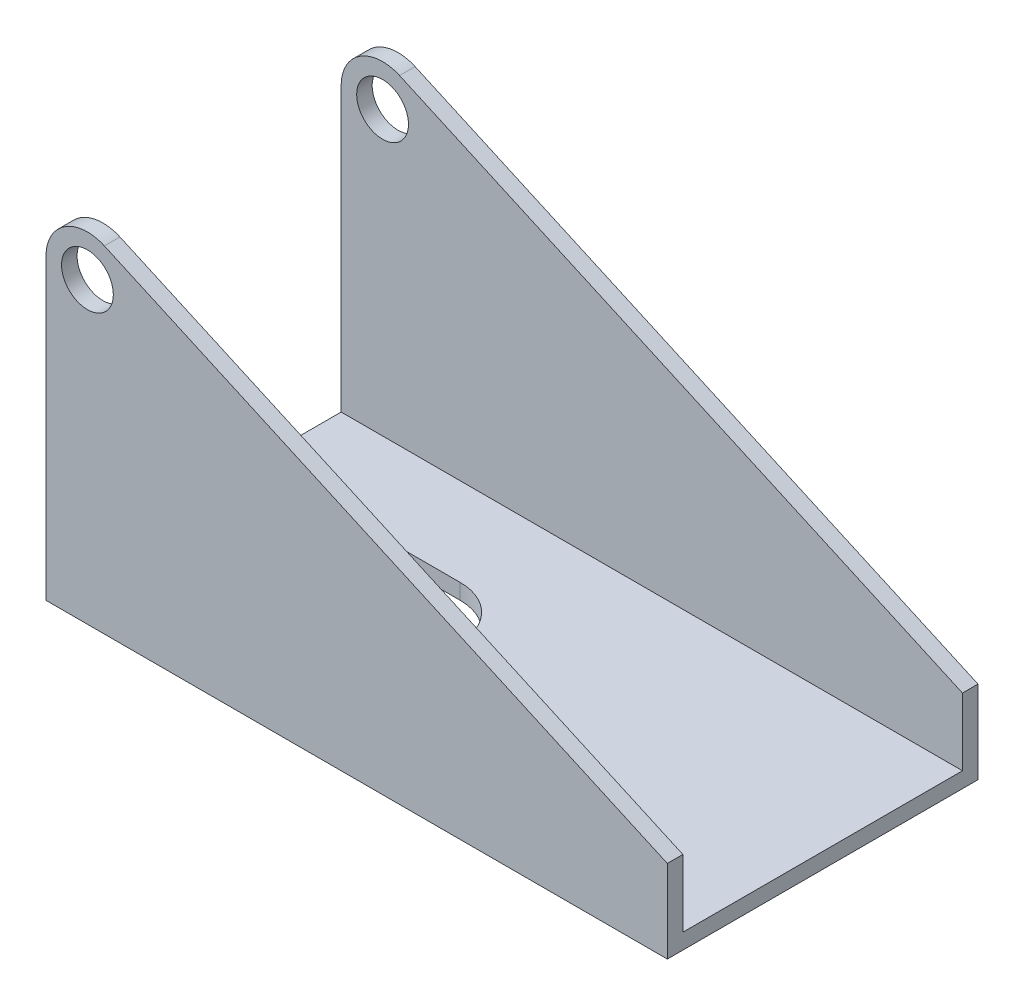
ISO-10303-21;
HEADER;
FILE_DESCRIPTION(('STEP AP214'),'2;1');
FILE_NAME('part.step','',(''),(''),'','','');
FILE_SCHEMA(('AUTOMOTIVE_DESIGN { 1 0 10303 214 1 1 1 1 }'));
ENDSEC;
DATA;
#1=APPLICATION_CONTEXT('core data for automotive mechanical design processes');
#2=APPLICATION_PROTOCOL_DEFINITION('international standard','automotive_design',2000,#1);
#3=PRODUCT_CONTEXT('',#1,'mechanical');
#4=PRODUCT('Part','Part','',(#3));
#5=PRODUCT_RELATED_PRODUCT_CATEGORY('part','',(#4));
#6=PRODUCT_DEFINITION_FORMATION('','',#4);
#7=PRODUCT_DEFINITION_CONTEXT('part definition',#1,'design');
#8=PRODUCT_DEFINITION('design','',#6,#7);
#9=PRODUCT_DEFINITION_SHAPE('','',#8);
#10=(LENGTH_UNIT() NAMED_UNIT(*) SI_UNIT(.MILLI.,.METRE.));
#11=(NAMED_UNIT(*) PLANE_ANGLE_UNIT() SI_UNIT($,.RADIAN.));
#12=(NAMED_UNIT(*) SI_UNIT($,.STERADIAN.) SOLID_ANGLE_UNIT());
#13=UNCERTAINTY_MEASURE_WITH_UNIT(LENGTH_MEASURE(1.E-05),#10,'distance_accuracy_value','');
#14=(GEOMETRIC_REPRESENTATION_CONTEXT(3) GLOBAL_UNCERTAINTY_ASSIGNED_CONTEXT((#13)) GLOBAL_UNIT_ASSIGNED_CONTEXT((#10,
#11,#12)) REPRESENTATION_CONTEXT('',''));
#15=CARTESIAN_POINT('',(0.,0.,0.));
#16=DIRECTION('',(0.,0.,1.));
#17=DIRECTION('',(1.,0.,0.));
#18=AXIS2_PLACEMENT_3D('',#15,#16,#17);
#19=CARTESIAN_POINT('',(-13.9101951841175,10.6588235294118,30.));
#20=DIRECTION('',(1.,0.,0.));
#21=DIRECTION('',(0.,0.,-1.));
#22=AXIS2_PLACEMENT_3D('',#19,#20,#21);
#23=PLANE('',#22);
#24=DIRECTION('',(0.,0.,1.));
#25=VECTOR('',#24,1.);
#26=CARTESIAN_POINT('',(-13.9101951841175,12.1588235294118,1.5));
#27=LINE('',#26,#25);
#28=CARTESIAN_POINT('',(-13.9101951841175,12.1588235294118,20.));
#29=VERTEX_POINT('',#28);
#30=CARTESIAN_POINT('',(-13.9101951841175,12.1588235294118,28.5));
#31=VERTEX_POINT('',#30);
#32=EDGE_CURVE('E170',#29,#31,#27,.T.);
#33=ORIENTED_EDGE('',*,*,#32,.F.);
#34=DIRECTION('',(0.,-1.,0.));
#35=VECTOR('',#34,1.);
#36=CARTESIAN_POINT('',(-13.9101951841175,10.6588235294118,20.));
#37=LINE('',#36,#35);
#38=CARTESIAN_POINT('',(-13.9101951841175,10.6588235294118,20.));
#39=VERTEX_POINT('',#38);
#40=EDGE_CURVE('E162',#29,#39,#37,.T.);
#41=ORIENTED_EDGE('',*,*,#40,.T.);
#42=DIRECTION('',(0.,0.,-1.));
#43=VECTOR('',#42,1.);
#44=CARTESIAN_POINT('',(-13.9101951841175,10.6588235294118,30.));
#45=LINE('',#44,#43);
#46=CARTESIAN_POINT('',(-13.9101951841175,10.6588235294118,30.));
#47=VERTEX_POINT('',#46);
#48=EDGE_CURVE('E239',#47,#39,#45,.T.);
#49=ORIENTED_EDGE('',*,*,#48,.F.);
#50=DIRECTION('',(0.,-1.,0.));
#51=VECTOR('',#50,1.);
#52=CARTESIAN_POINT('',(-13.9101951841175,10.6588235294118,30.));
#53=LINE('',#52,#51);
#54=CARTESIAN_POINT('',(-13.9101951841175,39.4724810895195,30.));
#55=VERTEX_POINT('',#54);
#56=EDGE_CURVE('E206',#55,#47,#53,.T.);
#57=ORIENTED_EDGE('',*,*,#56,.F.);
#58=DIRECTION('',(0.,0.,-1.));
#59=VECTOR('',#58,1.);
#60=CARTESIAN_POINT('',(-13.9101951841175,39.4724810895195,30.));
#61=LINE('',#60,#59);
#62=CARTESIAN_POINT('',(-13.9101951841175,39.4724810895195,28.5));
#63=VERTEX_POINT('',#62);
#64=EDGE_CURVE('E242',#55,#63,#61,.T.);
#65=ORIENTED_EDGE('',*,*,#64,.T.);
#66=DIRECTION('',(0.,1.,0.));
#67=VECTOR('',#66,1.);
#68=CARTESIAN_POINT('',(-13.9101951841175,74.7861386496272,28.5));
#69=LINE('',#68,#67);
#70=EDGE_CURVE('E165',#31,#63,#69,.T.);
#71=ORIENTED_EDGE('',*,*,#70,.F.);
#72=EDGE_LOOP('',(#33,#41,#49,#57,#65,#71));
#73=FACE_BOUND('',#72,.T.);
#74=ADVANCED_FACE('F32',(#73),#23,.F.);
#75=CARTESIAN_POINT('',(-9.91019518411749,39.4724810895195,30.));
#76=DIRECTION('',(0.,0.,-1.));
#77=DIRECTION('',(-1.,0.,0.));
#78=AXIS2_PLACEMENT_3D('',#75,#76,#77);
#79=CYLINDRICAL_SURFACE('',#78,4.);
#80=DIRECTION('',(0.,0.,-1.));
#81=VECTOR('',#80,1.);
#82=CARTESIAN_POINT('',(-8.2687364748023,43.1201671102199,30.));
#83=LINE('',#82,#81);
#84=CARTESIAN_POINT('',(-8.2687364748023,43.1201671102199,30.));
#85=VERTEX_POINT('',#84);
#86=CARTESIAN_POINT('',(-8.2687364748023,43.1201671102199,28.5));
#87=VERTEX_POINT('',#86);
#88=EDGE_CURVE('E228',#85,#87,#83,.T.);
#89=ORIENTED_EDGE('',*,*,#88,.T.);
#90=CARTESIAN_POINT('',(-9.91019518411749,39.4724810895195,28.5));
#91=DIRECTION('',(0.,0.,1.));
#92=DIRECTION('',(0.,-1.,0.));
#93=AXIS2_PLACEMENT_3D('',#90,#91,#92);
#94=CIRCLE('',#93,4.);
#95=EDGE_CURVE('E193',#87,#63,#94,.T.);
#96=ORIENTED_EDGE('',*,*,#95,.T.);
#97=ORIENTED_EDGE('',*,*,#64,.F.);
#98=CARTESIAN_POINT('',(-9.91019518411749,39.4724810895195,30.));
#99=DIRECTION('',(0.,0.,1.));
#100=DIRECTION('',(-1.,0.,0.));
#101=AXIS2_PLACEMENT_3D('',#98,#99,#100);
#102=CIRCLE('',#101,4.);
#103=EDGE_CURVE('E203',#85,#55,#102,.T.);
#104=ORIENTED_EDGE('',*,*,#103,.F.);
#105=EDGE_LOOP('',(#89,#96,#97,#104));
#106=FACE_BOUND('',#105,.T.);
#107=ADVANCED_FACE('F271',(#106),#79,.T.);
#108=CARTESIAN_POINT('',(-8.2687364748023,43.1201671102199,30.));
#109=DIRECTION('',(-0.410364677328798,-0.911921505175107,0.));
#110=DIRECTION('',(0.911921505175107,-0.410364677328798,0.));
#111=AXIS2_PLACEMENT_3D('',#108,#109,#110);
#112=PLANE('',#111);
#113=DIRECTION('',(0.,0.,-1.));
#114=VECTOR('',#113,1.);
#115=CARTESIAN_POINT('',(46.0898048158825,18.6588235294118,30.));
#116=LINE('',#115,#114);
#117=CARTESIAN_POINT('',(46.0898048158825,18.6588235294118,30.));
#118=VERTEX_POINT('',#117);
#119=CARTESIAN_POINT('',(46.0898048158825,18.6588235294118,28.5));
#120=VERTEX_POINT('',#119);
#121=EDGE_CURVE('E232',#118,#120,#116,.T.);
#122=ORIENTED_EDGE('',*,*,#121,.T.);
#123=DIRECTION('',(-0.911921505175107,0.410364677328798,0.));
#124=VECTOR('',#123,1.);
#125=CARTESIAN_POINT('',(-8.2687364748023,43.1201671102199,28.5));
#126=LINE('',#125,#124);
#127=EDGE_CURVE('E187',#120,#87,#126,.T.);
#128=ORIENTED_EDGE('',*,*,#127,.T.);
#129=ORIENTED_EDGE('',*,*,#88,.F.);
#130=DIRECTION('',(-0.911921505175106,0.410364677328798,0.));
#131=VECTOR('',#130,1.);
#132=CARTESIAN_POINT('',(-8.2687364748023,43.1201671102199,30.));
#133=LINE('',#132,#131);
#134=EDGE_CURVE('E213',#118,#85,#133,.T.);
#135=ORIENTED_EDGE('',*,*,#134,.F.);
#136=EDGE_LOOP('',(#122,#128,#129,#135));
#137=FACE_BOUND('',#136,.T.);
#138=ADVANCED_FACE('F276',(#137),#112,.F.);
#139=CARTESIAN_POINT('',(-9.91019518411749,39.4724810895195,0.));
#140=DIRECTION('',(0.,0.,1.));
#141=DIRECTION('',(1.,0.,0.));
#142=AXIS2_PLACEMENT_3D('',#139,#140,#141);
#143=CYLINDRICAL_SURFACE('',#142,2.5);
#144=CARTESIAN_POINT('',(-9.91019518411749,39.4724810895195,28.5));
#145=DIRECTION('',(0.,0.,1.));
#146=DIRECTION('',(0.,-1.,0.));
#147=AXIS2_PLACEMENT_3D('',#144,#145,#146);
#148=CIRCLE('',#147,2.5);
#149=CARTESIAN_POINT('',(-9.91019518411749,36.9724810895195,28.5));
#150=VERTEX_POINT('',#149);
#151=EDGE_CURVE('E186',#150,#150,#148,.F.);
#152=ORIENTED_EDGE('',*,*,#151,.T.);
#153=EDGE_LOOP('',(#152));
#154=FACE_BOUND('',#153,.T.);
#155=CARTESIAN_POINT('',(-9.91019518411749,39.4724810895195,30.));
#156=DIRECTION('',(0.,0.,1.));
#157=DIRECTION('',(1.,0.,0.));
#158=AXIS2_PLACEMENT_3D('',#155,#156,#157);
#159=CIRCLE('',#158,2.5);
#160=CARTESIAN_POINT('',(-7.41019518411749,39.4724810895195,30.));
#161=VERTEX_POINT('',#160);
#162=EDGE_CURVE('E196',#161,#161,#159,.T.);
#163=ORIENTED_EDGE('',*,*,#162,.T.);
#164=EDGE_LOOP('',(#163));
#165=FACE_BOUND('',#164,.T.);
#166=ADVANCED_FACE('F294',(#154,#165),#143,.F.);
#167=CARTESIAN_POINT('',(-13.9101951841175,39.4724810895195,1.5));
#168=VERTEX_POINT('',#167);
#169=CARTESIAN_POINT('',(-13.9101951841175,39.4724810895195,0.));
#170=VERTEX_POINT('',#169);
#171=EDGE_CURVE('E241',#168,#170,#61,.T.);
#172=ORIENTED_EDGE('',*,*,#171,.F.);
#173=CARTESIAN_POINT('',(-9.91019518411749,39.4724810895195,1.5));
#174=DIRECTION('',(0.,0.,-1.));
#175=DIRECTION('',(-1.,0.,0.));
#176=AXIS2_PLACEMENT_3D('',#173,#174,#175);
#177=CIRCLE('',#176,4.);
#178=CARTESIAN_POINT('',(-8.2687364748023,43.1201671102199,1.5));
#179=VERTEX_POINT('',#178);
#180=EDGE_CURVE('E183',#168,#179,#177,.T.);
#181=ORIENTED_EDGE('',*,*,#180,.T.);
#182=CARTESIAN_POINT('',(-8.2687364748023,43.1201671102199,0.));
#183=VERTEX_POINT('',#182);
#184=EDGE_CURVE('E215',#179,#183,#83,.T.);
#185=ORIENTED_EDGE('',*,*,#184,.T.);
#186=CARTESIAN_POINT('',(-9.91019518411749,39.4724810895195,0.));
#187=DIRECTION('',(0.,0.,1.));
#188=DIRECTION('',(-1.,0.,0.));
#189=AXIS2_PLACEMENT_3D('',#186,#187,#188);
#190=CIRCLE('',#189,4.);
#191=EDGE_CURVE('E200',#183,#170,#190,.T.);
#192=ORIENTED_EDGE('',*,*,#191,.T.);
#193=EDGE_LOOP('',(#172,#181,#185,#192));
#194=FACE_BOUND('',#193,.T.);
#195=ADVANCED_FACE('F34',(#194),#79,.T.);
#196=CARTESIAN_POINT('',(-13.9101951841175,10.6588235294118,10.));
#197=VERTEX_POINT('',#196);
#198=CARTESIAN_POINT('',(-13.9101951841175,10.6588235294118,0.));
#199=VERTEX_POINT('',#198);
#200=EDGE_CURVE('E238',#197,#199,#45,.T.);
#201=ORIENTED_EDGE('',*,*,#200,.F.);
#202=DIRECTION('',(0.,1.,0.));
#203=VECTOR('',#202,1.);
#204=CARTESIAN_POINT('',(-13.9101951841175,10.6588235294118,10.));
#205=LINE('',#204,#203);
#206=CARTESIAN_POINT('',(-13.9101951841175,12.1588235294118,10.));
#207=VERTEX_POINT('',#206);
#208=EDGE_CURVE('E148',#197,#207,#205,.T.);
#209=ORIENTED_EDGE('',*,*,#208,.T.);
#210=CARTESIAN_POINT('',(-13.9101951841175,12.1588235294118,1.5));
#211=VERTEX_POINT('',#210);
#212=EDGE_CURVE('E171',#211,#207,#27,.T.);
#213=ORIENTED_EDGE('',*,*,#212,.F.);
#214=DIRECTION('',(0.,-1.,0.));
#215=VECTOR('',#214,1.);
#216=CARTESIAN_POINT('',(-13.9101951841175,74.7861386496272,1.5));
#217=LINE('',#216,#215);
#218=EDGE_CURVE('E167',#168,#211,#217,.T.);
#219=ORIENTED_EDGE('',*,*,#218,.F.);
#220=ORIENTED_EDGE('',*,*,#171,.T.);
#221=DIRECTION('',(0.,-1.,0.));
#222=VECTOR('',#221,1.);
#223=CARTESIAN_POINT('',(-13.9101951841175,10.6588235294118,0.));
#224=LINE('',#223,#222);
#225=EDGE_CURVE('E218',#170,#199,#224,.T.);
#226=ORIENTED_EDGE('',*,*,#225,.T.);
#227=EDGE_LOOP('',(#201,#209,#213,#219,#220,#226));
#228=FACE_BOUND('',#227,.T.);
#229=ADVANCED_FACE('F261',(#228),#23,.F.);
#230=CARTESIAN_POINT('',(46.0898048158825,10.6588235294118,30.));
#231=DIRECTION('',(0.,1.,0.));
#232=DIRECTION('',(-1.,0.,0.));
#233=AXIS2_PLACEMENT_3D('',#230,#231,#232);
#234=PLANE('',#233);
#235=ORIENTED_EDGE('',*,*,#48,.T.);
#236=DIRECTION('',(1.,0.,0.));
#237=VECTOR('',#236,1.);
#238=CARTESIAN_POINT('',(-33.9101951841175,10.6588235294118,20.));
#239=LINE('',#238,#237);
#240=CARTESIAN_POINT('',(6.0898048158825,10.6588235294118,20.));
#241=VERTEX_POINT('',#240);
#242=EDGE_CURVE('E142',#39,#241,#239,.T.);
#243=ORIENTED_EDGE('',*,*,#242,.T.);
#244=CARTESIAN_POINT('',(6.0898048158825,10.6588235294118,15.));
#245=DIRECTION('',(0.,1.,0.));
#246=DIRECTION('',(0.,0.,1.));
#247=AXIS2_PLACEMENT_3D('',#244,#245,#246);
#248=CIRCLE('',#247,5.);
#249=CARTESIAN_POINT('',(6.0898048158825,10.6588235294118,10.));
#250=VERTEX_POINT('',#249);
#251=EDGE_CURVE('E137',#241,#250,#248,.T.);
#252=ORIENTED_EDGE('',*,*,#251,.T.);
#253=DIRECTION('',(-1.,0.,0.));
#254=VECTOR('',#253,1.);
#255=CARTESIAN_POINT('',(-33.9101951841175,10.6588235294118,10.));
#256=LINE('',#255,#254);
#257=EDGE_CURVE('E145',#250,#197,#256,.T.);
#258=ORIENTED_EDGE('',*,*,#257,.T.);
#259=ORIENTED_EDGE('',*,*,#200,.T.);
#260=DIRECTION('',(1.,0.,0.));
#261=VECTOR('',#260,1.);
#262=CARTESIAN_POINT('',(46.0898048158825,10.6588235294118,0.));
#263=LINE('',#262,#261);
#264=CARTESIAN_POINT('',(46.0898048158825,10.6588235294118,0.));
#265=VERTEX_POINT('',#264);
#266=EDGE_CURVE('E221',#199,#265,#263,.T.);
#267=ORIENTED_EDGE('',*,*,#266,.T.);
#268=DIRECTION('',(0.,0.,-1.));
#269=VECTOR('',#268,1.);
#270=CARTESIAN_POINT('',(46.0898048158825,10.6588235294118,30.));
#271=LINE('',#270,#269);
#272=CARTESIAN_POINT('',(46.0898048158825,10.6588235294118,30.));
#273=VERTEX_POINT('',#272);
#274=EDGE_CURVE('E235',#273,#265,#271,.T.);
#275=ORIENTED_EDGE('',*,*,#274,.F.);
#276=DIRECTION('',(1.,0.,0.));
#277=VECTOR('',#276,1.);
#278=CARTESIAN_POINT('',(46.0898048158825,10.6588235294118,30.));
#279=LINE('',#278,#277);
#280=EDGE_CURVE('E209',#47,#273,#279,.T.);
#281=ORIENTED_EDGE('',*,*,#280,.F.);
#282=EDGE_LOOP('',(#235,#243,#252,#258,#259,#267,#275,#281));
#283=FACE_BOUND('',#282,.T.);
#284=ADVANCED_FACE('F153',(#283),#234,.F.);
#285=CARTESIAN_POINT('',(46.0898048158825,18.6588235294118,30.));
#286=DIRECTION('',(-1.,0.,0.));
#287=DIRECTION('',(0.,0.,1.));
#288=AXIS2_PLACEMENT_3D('',#285,#286,#287);
#289=PLANE('',#288);
#290=DIRECTION('',(0.,0.,1.));
#291=VECTOR('',#290,1.);
#292=CARTESIAN_POINT('',(46.0898048158825,12.1588235294118,30.));
#293=LINE('',#292,#291);
#294=CARTESIAN_POINT('',(46.0898048158825,12.1588235294118,1.5));
#295=VERTEX_POINT('',#294);
#296=CARTESIAN_POINT('',(46.0898048158825,12.1588235294118,28.5));
#297=VERTEX_POINT('',#296);
#298=EDGE_CURVE('E40',#295,#297,#293,.T.);
#299=ORIENTED_EDGE('',*,*,#298,.T.);
#300=DIRECTION('',(0.,1.,0.));
#301=VECTOR('',#300,1.);
#302=CARTESIAN_POINT('',(46.0898048158825,18.6588235294118,28.5));
#303=LINE('',#302,#301);
#304=EDGE_CURVE('E190',#297,#120,#303,.T.);
#305=ORIENTED_EDGE('',*,*,#304,.T.);
#306=ORIENTED_EDGE('',*,*,#121,.F.);
#307=DIRECTION('',(0.,1.,0.));
#308=VECTOR('',#307,1.);
#309=CARTESIAN_POINT('',(46.0898048158825,18.6588235294118,30.));
#310=LINE('',#309,#308);
#311=EDGE_CURVE('E211',#273,#118,#310,.T.);
#312=ORIENTED_EDGE('',*,*,#311,.F.);
#313=ORIENTED_EDGE('',*,*,#274,.T.);
#314=DIRECTION('',(0.,1.,0.));
#315=VECTOR('',#314,1.);
#316=CARTESIAN_POINT('',(46.0898048158825,18.6588235294118,0.));
#317=LINE('',#316,#315);
#318=CARTESIAN_POINT('',(46.0898048158825,18.6588235294118,0.));
#319=VERTEX_POINT('',#318);
#320=EDGE_CURVE('E223',#265,#319,#317,.T.);
#321=ORIENTED_EDGE('',*,*,#320,.T.);
#322=CARTESIAN_POINT('',(46.0898048158825,18.6588235294118,1.5));
#323=VERTEX_POINT('',#322);
#324=EDGE_CURVE('E231',#323,#319,#116,.T.);
#325=ORIENTED_EDGE('',*,*,#324,.F.);
#326=DIRECTION('',(0.,-1.,0.));
#327=VECTOR('',#326,1.);
#328=CARTESIAN_POINT('',(46.0898048158825,18.6588235294118,1.5));
#329=LINE('',#328,#327);
#330=EDGE_CURVE('E55',#323,#295,#329,.T.);
#331=ORIENTED_EDGE('',*,*,#330,.T.);
#332=EDGE_LOOP('',(#299,#305,#306,#312,#313,#321,#325,#331));
#333=FACE_BOUND('',#332,.T.);
#334=ADVANCED_FACE('F250',(#333),#289,.F.);
#335=ORIENTED_EDGE('',*,*,#184,.F.);
#336=DIRECTION('',(0.911921505175107,-0.410364677328798,0.));
#337=VECTOR('',#336,1.);
#338=CARTESIAN_POINT('',(-8.2687364748023,43.1201671102199,1.5));
#339=LINE('',#338,#337);
#340=EDGE_CURVE('E180',#179,#323,#339,.T.);
#341=ORIENTED_EDGE('',*,*,#340,.T.);
#342=ORIENTED_EDGE('',*,*,#324,.T.);
#343=DIRECTION('',(-0.911921505175106,0.410364677328798,0.));
#344=VECTOR('',#343,1.);
#345=CARTESIAN_POINT('',(-8.2687364748023,43.1201671102199,0.));
#346=LINE('',#345,#344);
#347=EDGE_CURVE('E207',#319,#183,#346,.T.);
#348=ORIENTED_EDGE('',*,*,#347,.T.);
#349=EDGE_LOOP('',(#335,#341,#342,#348));
#350=FACE_BOUND('',#349,.T.);
#351=ADVANCED_FACE('F291',(#350),#112,.F.);
#352=CARTESIAN_POINT('',(-9.91019518411749,39.4724810895195,30.));
#353=DIRECTION('',(0.,0.,-1.));
#354=DIRECTION('',(-1.,0.,0.));
#355=AXIS2_PLACEMENT_3D('',#352,#353,#354);
#356=PLANE('',#355);
#357=ORIENTED_EDGE('',*,*,#162,.F.);
#358=EDGE_LOOP('',(#357));
#359=FACE_BOUND('',#358,.T.);
#360=ORIENTED_EDGE('',*,*,#103,.T.);
#361=ORIENTED_EDGE('',*,*,#56,.T.);
#362=ORIENTED_EDGE('',*,*,#280,.T.);
#363=ORIENTED_EDGE('',*,*,#311,.T.);
#364=ORIENTED_EDGE('',*,*,#134,.T.);
#365=EDGE_LOOP('',(#360,#361,#362,#363,#364));
#366=FACE_BOUND('',#365,.T.);
#367=ADVANCED_FACE('F281',(#359,#366),#356,.F.);
#368=CARTESIAN_POINT('',(-9.91019518411749,39.4724810895195,0.));
#369=DIRECTION('',(0.,0.,-1.));
#370=DIRECTION('',(-1.,0.,0.));
#371=AXIS2_PLACEMENT_3D('',#368,#369,#370);
#372=PLANE('',#371);
#373=CARTESIAN_POINT('',(-9.91019518411749,39.4724810895195,0.));
#374=DIRECTION('',(0.,0.,1.));
#375=DIRECTION('',(1.,0.,0.));
#376=AXIS2_PLACEMENT_3D('',#373,#374,#375);
#377=CIRCLE('',#376,2.5);
#378=CARTESIAN_POINT('',(-7.41019518411749,39.4724810895195,0.));
#379=VERTEX_POINT('',#378);
#380=EDGE_CURVE('E197',#379,#379,#377,.T.);
#381=ORIENTED_EDGE('',*,*,#380,.T.);
#382=EDGE_LOOP('',(#381));
#383=FACE_BOUND('',#382,.T.);
#384=ORIENTED_EDGE('',*,*,#191,.F.);
#385=ORIENTED_EDGE('',*,*,#347,.F.);
#386=ORIENTED_EDGE('',*,*,#320,.F.);
#387=ORIENTED_EDGE('',*,*,#266,.F.);
#388=ORIENTED_EDGE('',*,*,#225,.F.);
#389=EDGE_LOOP('',(#384,#385,#386,#387,#388));
#390=FACE_BOUND('',#389,.T.);
#391=ADVANCED_FACE('F287',(#383,#390),#372,.T.);
#392=CARTESIAN_POINT('',(-9.91019518411749,39.4724810895195,1.5));
#393=DIRECTION('',(0.,0.,-1.));
#394=DIRECTION('',(-1.,0.,0.));
#395=AXIS2_PLACEMENT_3D('',#392,#393,#394);
#396=CIRCLE('',#395,2.5);
#397=CARTESIAN_POINT('',(-12.4101951841175,39.4724810895195,1.5));
#398=VERTEX_POINT('',#397);
#399=EDGE_CURVE('E178',#398,#398,#396,.F.);
#400=ORIENTED_EDGE('',*,*,#399,.T.);
#401=EDGE_LOOP('',(#400));
#402=FACE_BOUND('',#401,.T.);
#403=ORIENTED_EDGE('',*,*,#380,.F.);
#404=EDGE_LOOP('',(#403));
#405=FACE_BOUND('',#404,.T.);
#406=ADVANCED_FACE('F301',(#402,#405),#143,.F.);
#407=CARTESIAN_POINT('',(58.0898048158825,12.1588235294118,1.5));
#408=DIRECTION('',(0.,-1.,0.));
#409=DIRECTION('',(0.,0.,-1.));
#410=AXIS2_PLACEMENT_3D('',#407,#408,#409);
#411=PLANE('',#410);
#412=CARTESIAN_POINT('',(6.0898048158825,12.1588235294118,15.));
#413=DIRECTION('',(0.,1.,0.));
#414=DIRECTION('',(0.,0.,1.));
#415=AXIS2_PLACEMENT_3D('',#412,#413,#414);
#416=CIRCLE('',#415,5.);
#417=CARTESIAN_POINT('',(6.0898048158825,12.1588235294118,20.));
#418=VERTEX_POINT('',#417);
#419=CARTESIAN_POINT('',(6.0898048158825,12.1588235294118,10.));
#420=VERTEX_POINT('',#419);
#421=EDGE_CURVE('E47',#418,#420,#416,.T.);
#422=ORIENTED_EDGE('',*,*,#421,.F.);
#423=DIRECTION('',(-1.,0.,0.));
#424=VECTOR('',#423,1.);
#425=CARTESIAN_POINT('',(58.0898048158825,12.1588235294118,20.));
#426=LINE('',#425,#424);
#427=EDGE_CURVE('E11',#418,#29,#426,.T.);
#428=ORIENTED_EDGE('',*,*,#427,.T.);
#429=ORIENTED_EDGE('',*,*,#32,.T.);
#430=DIRECTION('',(-1.,0.,0.));
#431=VECTOR('',#430,1.);
#432=CARTESIAN_POINT('',(58.0898048158825,12.1588235294118,28.5));
#433=LINE('',#432,#431);
#434=EDGE_CURVE('E175',#297,#31,#433,.T.);
#435=ORIENTED_EDGE('',*,*,#434,.F.);
#436=ORIENTED_EDGE('',*,*,#298,.F.);
#437=DIRECTION('',(-1.,0.,0.));
#438=VECTOR('',#437,1.);
#439=CARTESIAN_POINT('',(58.0898048158825,12.1588235294118,1.5));
#440=LINE('',#439,#438);
#441=EDGE_CURVE('E174',#295,#211,#440,.T.);
#442=ORIENTED_EDGE('',*,*,#441,.T.);
#443=ORIENTED_EDGE('',*,*,#212,.T.);
#444=DIRECTION('',(-1.,0.,0.));
#445=VECTOR('',#444,1.);
#446=CARTESIAN_POINT('',(-33.9101951841175,12.1588235294118,10.));
#447=LINE('',#446,#445);
#448=EDGE_CURVE('E154',#420,#207,#447,.T.);
#449=ORIENTED_EDGE('',*,*,#448,.F.);
#450=EDGE_LOOP('',(#422,#428,#429,#435,#436,#442,#443,#449));
#451=FACE_BOUND('',#450,.T.);
#452=ADVANCED_FACE('F255',(#451),#411,.F.);
#453=CARTESIAN_POINT('',(58.0898048158825,74.7861386496272,28.5));
#454=DIRECTION('',(0.,0.,1.));
#455=DIRECTION('',(0.,-1.,0.));
#456=AXIS2_PLACEMENT_3D('',#453,#454,#455);
#457=PLANE('',#456);
#458=ORIENTED_EDGE('',*,*,#151,.F.);
#459=EDGE_LOOP('',(#458));
#460=FACE_BOUND('',#459,.T.);
#461=ORIENTED_EDGE('',*,*,#127,.F.);
#462=ORIENTED_EDGE('',*,*,#304,.F.);
#463=ORIENTED_EDGE('',*,*,#434,.T.);
#464=ORIENTED_EDGE('',*,*,#70,.T.);
#465=ORIENTED_EDGE('',*,*,#95,.F.);
#466=EDGE_LOOP('',(#461,#462,#463,#464,#465));
#467=FACE_BOUND('',#466,.T.);
#468=ADVANCED_FACE('F269',(#460,#467),#457,.F.);
#469=CARTESIAN_POINT('',(58.0898048158825,74.7861386496272,1.5));
#470=DIRECTION('',(0.,0.,-1.));
#471=DIRECTION('',(-1.,0.,0.));
#472=AXIS2_PLACEMENT_3D('',#469,#470,#471);
#473=PLANE('',#472);
#474=ORIENTED_EDGE('',*,*,#399,.F.);
#475=EDGE_LOOP('',(#474));
#476=FACE_BOUND('',#475,.T.);
#477=ORIENTED_EDGE('',*,*,#218,.T.);
#478=ORIENTED_EDGE('',*,*,#441,.F.);
#479=ORIENTED_EDGE('',*,*,#330,.F.);
#480=ORIENTED_EDGE('',*,*,#340,.F.);
#481=ORIENTED_EDGE('',*,*,#180,.F.);
#482=EDGE_LOOP('',(#477,#478,#479,#480,#481));
#483=FACE_BOUND('',#482,.T.);
#484=ADVANCED_FACE('F256',(#476,#483),#473,.F.);
#485=CARTESIAN_POINT('',(-33.9101951841175,10.6588235294118,20.));
#486=DIRECTION('',(0.,0.,1.));
#487=DIRECTION('',(1.,0.,0.));
#488=AXIS2_PLACEMENT_3D('',#485,#486,#487);
#489=PLANE('',#488);
#490=ORIENTED_EDGE('',*,*,#427,.F.);
#491=DIRECTION('',(0.,1.,0.));
#492=VECTOR('',#491,1.);
#493=CARTESIAN_POINT('',(6.0898048158825,10.6588235294118,20.));
#494=LINE('',#493,#492);
#495=EDGE_CURVE('E141',#241,#418,#494,.T.);
#496=ORIENTED_EDGE('',*,*,#495,.F.);
#497=ORIENTED_EDGE('',*,*,#242,.F.);
#498=ORIENTED_EDGE('',*,*,#40,.F.);
#499=EDGE_LOOP('',(#490,#496,#497,#498));
#500=FACE_BOUND('',#499,.T.);
#501=ADVANCED_FACE('F326',(#500),#489,.F.);
#502=CARTESIAN_POINT('',(-33.9101951841175,10.6588235294118,10.));
#503=DIRECTION('',(0.,0.,-1.));
#504=DIRECTION('',(-1.,0.,0.));
#505=AXIS2_PLACEMENT_3D('',#502,#503,#504);
#506=PLANE('',#505);
#507=ORIENTED_EDGE('',*,*,#257,.F.);
#508=DIRECTION('',(0.,1.,0.));
#509=VECTOR('',#508,1.);
#510=CARTESIAN_POINT('',(6.0898048158825,10.6588235294118,10.));
#511=LINE('',#510,#509);
#512=EDGE_CURVE('E133',#250,#420,#511,.T.);
#513=ORIENTED_EDGE('',*,*,#512,.T.);
#514=ORIENTED_EDGE('',*,*,#448,.T.);
#515=ORIENTED_EDGE('',*,*,#208,.F.);
#516=EDGE_LOOP('',(#507,#513,#514,#515));
#517=FACE_BOUND('',#516,.T.);
#518=ADVANCED_FACE('F146',(#517),#506,.F.);
#519=CARTESIAN_POINT('',(6.0898048158825,10.6588235294118,15.));
#520=DIRECTION('',(0.,1.,0.));
#521=DIRECTION('',(0.,0.,1.));
#522=AXIS2_PLACEMENT_3D('',#519,#520,#521);
#523=CYLINDRICAL_SURFACE('',#522,5.);
#524=ORIENTED_EDGE('',*,*,#421,.T.);
#525=ORIENTED_EDGE('',*,*,#512,.F.);
#526=ORIENTED_EDGE('',*,*,#251,.F.);
#527=ORIENTED_EDGE('',*,*,#495,.T.);
#528=EDGE_LOOP('',(#524,#525,#526,#527));
#529=FACE_BOUND('',#528,.T.);
#530=ADVANCED_FACE('F135',(#529),#523,.F.);
#531=CLOSED_SHELL('',(#74,#107,#138,#166,#195,#229,#284,#334,#351,#367,#391,#406,#452,#468,#484,
#501,#518,#530));
#532=MANIFOLD_SOLID_BREP('B2',#531);
#533=ADVANCED_BREP_SHAPE_REPRESENTATION('',(#18,#532),#14);
#534=SHAPE_DEFINITION_REPRESENTATION(#9,#533);
ENDSEC;
END-ISO-10303-21;
